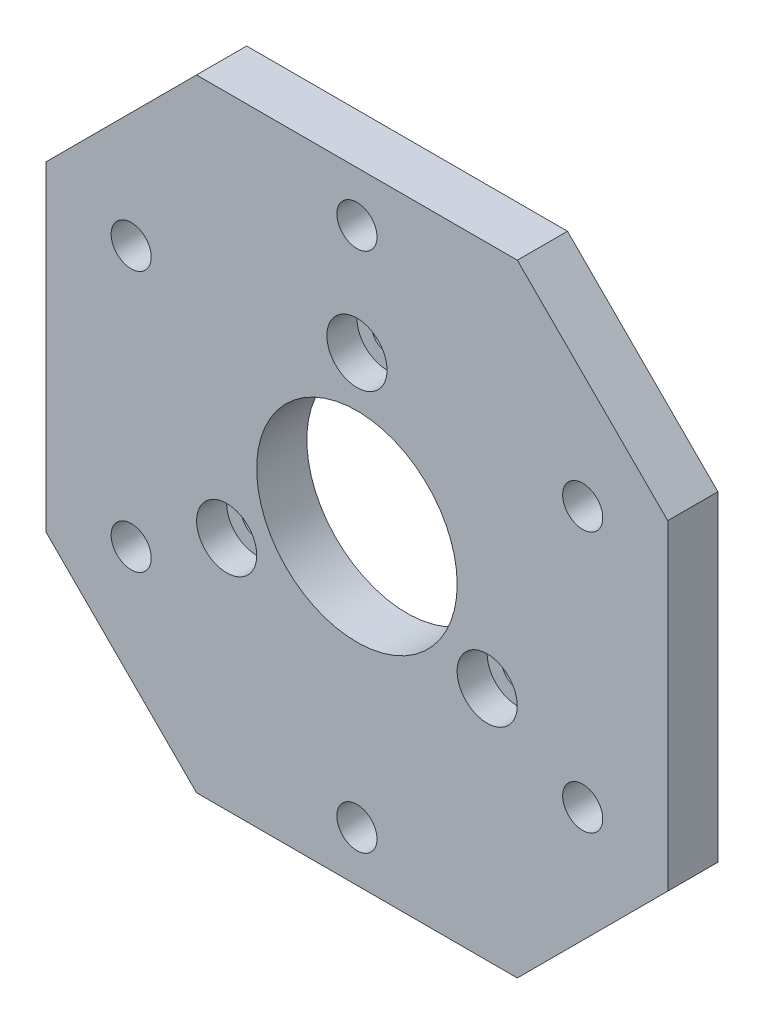
ISO-10303-21;
HEADER;
FILE_DESCRIPTION(('STEP AP214'),'2;1');
FILE_NAME('part.step','',(''),(''),'','','');
FILE_SCHEMA(('AUTOMOTIVE_DESIGN { 1 0 10303 214 1 1 1 1 }'));
ENDSEC;
DATA;
#1=APPLICATION_CONTEXT('core data for automotive mechanical design processes');
#2=APPLICATION_PROTOCOL_DEFINITION('international standard','automotive_design',2000,#1);
#3=PRODUCT_CONTEXT('',#1,'mechanical');
#4=PRODUCT('Part','Part','',(#3));
#5=PRODUCT_RELATED_PRODUCT_CATEGORY('part','',(#4));
#6=PRODUCT_DEFINITION_FORMATION('','',#4);
#7=PRODUCT_DEFINITION_CONTEXT('part definition',#1,'design');
#8=PRODUCT_DEFINITION('design','',#6,#7);
#9=PRODUCT_DEFINITION_SHAPE('','',#8);
#10=(LENGTH_UNIT() NAMED_UNIT(*) SI_UNIT(.MILLI.,.METRE.));
#11=(NAMED_UNIT(*) PLANE_ANGLE_UNIT() SI_UNIT($,.RADIAN.));
#12=(NAMED_UNIT(*) SI_UNIT($,.STERADIAN.) SOLID_ANGLE_UNIT());
#13=UNCERTAINTY_MEASURE_WITH_UNIT(LENGTH_MEASURE(1.E-05),#10,'distance_accuracy_value','');
#14=(GEOMETRIC_REPRESENTATION_CONTEXT(3) GLOBAL_UNCERTAINTY_ASSIGNED_CONTEXT((#13)) GLOBAL_UNIT_ASSIGNED_CONTEXT((#10,
#11,#12)) REPRESENTATION_CONTEXT('',''));
#15=CARTESIAN_POINT('',(0.,0.,0.));
#16=DIRECTION('',(0.,0.,1.));
#17=DIRECTION('',(1.,0.,0.));
#18=AXIS2_PLACEMENT_3D('',#15,#16,#17);
#19=CARTESIAN_POINT('',(0.,15.,5.));
#20=DIRECTION('',(0.,0.,-1.));
#21=DIRECTION('',(-1.,0.,0.));
#22=AXIS2_PLACEMENT_3D('',#19,#20,#21);
#23=CYLINDRICAL_SURFACE('',#22,1.5);
#24=CARTESIAN_POINT('',(0.,15.,0.));
#25=DIRECTION('',(0.,0.,1.));
#26=DIRECTION('',(1.,0.,0.));
#27=AXIS2_PLACEMENT_3D('',#24,#25,#26);
#28=CIRCLE('',#27,1.5);
#29=CARTESIAN_POINT('',(1.49999999999999,15.,0.));
#30=VERTEX_POINT('',#29);
#31=EDGE_CURVE('E212',#30,#30,#28,.T.);
#32=ORIENTED_EDGE('',*,*,#31,.F.);
#33=EDGE_LOOP('',(#32));
#34=FACE_BOUND('',#33,.T.);
#35=CARTESIAN_POINT('',(0.,15.,2.));
#36=DIRECTION('',(0.,0.,1.));
#37=DIRECTION('',(1.,0.,0.));
#38=AXIS2_PLACEMENT_3D('',#35,#36,#37);
#39=CIRCLE('',#38,1.5);
#40=CARTESIAN_POINT('',(1.49999999999999,15.,2.));
#41=VERTEX_POINT('',#40);
#42=EDGE_CURVE('E41',#41,#41,#39,.T.);
#43=ORIENTED_EDGE('',*,*,#42,.T.);
#44=EDGE_LOOP('',(#43));
#45=FACE_BOUND('',#44,.T.);
#46=ADVANCED_FACE('F37',(#34,#45),#23,.F.);
#47=CARTESIAN_POINT('',(12.9903810567675,-7.49999999999945,5.));
#48=DIRECTION('',(0.,0.,-1.));
#49=DIRECTION('',(-1.,0.,0.));
#50=AXIS2_PLACEMENT_3D('',#47,#48,#49);
#51=CYLINDRICAL_SURFACE('',#50,1.50000000000081);
#52=CARTESIAN_POINT('',(12.9903810567675,-7.49999999999945,0.));
#53=DIRECTION('',(0.,0.,1.));
#54=DIRECTION('',(1.,0.,0.));
#55=AXIS2_PLACEMENT_3D('',#52,#53,#54);
#56=CIRCLE('',#55,1.50000000000081);
#57=CARTESIAN_POINT('',(14.4903810567684,-7.49999999999945,0.));
#58=VERTEX_POINT('',#57);
#59=EDGE_CURVE('E181',#58,#58,#56,.T.);
#60=ORIENTED_EDGE('',*,*,#59,.F.);
#61=EDGE_LOOP('',(#60));
#62=FACE_BOUND('',#61,.T.);
#63=CARTESIAN_POINT('',(12.9903810567675,-7.49999999999945,2.));
#64=DIRECTION('',(0.,0.,1.));
#65=DIRECTION('',(1.,0.,0.));
#66=AXIS2_PLACEMENT_3D('',#63,#64,#65);
#67=CIRCLE('',#66,1.50000000000081);
#68=CARTESIAN_POINT('',(14.4903810567684,-7.49999999999945,2.));
#69=VERTEX_POINT('',#68);
#70=EDGE_CURVE('E145',#69,#69,#67,.T.);
#71=ORIENTED_EDGE('',*,*,#70,.T.);
#72=EDGE_LOOP('',(#71));
#73=FACE_BOUND('',#72,.T.);
#74=ADVANCED_FACE('F261',(#62,#73),#51,.F.);
#75=CARTESIAN_POINT('',(-12.9903810567656,-7.50000000000055,5.));
#76=DIRECTION('',(0.,0.,-1.));
#77=DIRECTION('',(-1.,0.,0.));
#78=AXIS2_PLACEMENT_3D('',#75,#76,#77);
#79=CYLINDRICAL_SURFACE('',#78,1.50000000000119);
#80=CARTESIAN_POINT('',(-12.9903810567656,-7.50000000000055,0.));
#81=DIRECTION('',(0.,0.,1.));
#82=DIRECTION('',(1.,0.,0.));
#83=AXIS2_PLACEMENT_3D('',#80,#81,#82);
#84=CIRCLE('',#83,1.50000000000119);
#85=CARTESIAN_POINT('',(-11.4903810567644,-7.50000000000055,0.));
#86=VERTEX_POINT('',#85);
#87=EDGE_CURVE('E178',#86,#86,#84,.T.);
#88=ORIENTED_EDGE('',*,*,#87,.F.);
#89=EDGE_LOOP('',(#88));
#90=FACE_BOUND('',#89,.T.);
#91=CARTESIAN_POINT('',(-12.9903810567656,-7.50000000000055,2.));
#92=DIRECTION('',(0.,0.,1.));
#93=DIRECTION('',(1.,0.,0.));
#94=AXIS2_PLACEMENT_3D('',#91,#92,#93);
#95=CIRCLE('',#94,1.50000000000119);
#96=CARTESIAN_POINT('',(-11.4903810567644,-7.50000000000055,2.));
#97=VERTEX_POINT('',#96);
#98=EDGE_CURVE('E143',#97,#97,#95,.T.);
#99=ORIENTED_EDGE('',*,*,#98,.T.);
#100=EDGE_LOOP('',(#99));
#101=FACE_BOUND('',#100,.T.);
#102=ADVANCED_FACE('F267',(#90,#101),#79,.F.);
#103=CARTESIAN_POINT('',(0.,0.,5.));
#104=DIRECTION('',(0.,0.,-1.));
#105=DIRECTION('',(-1.,0.,0.));
#106=AXIS2_PLACEMENT_3D('',#103,#104,#105);
#107=PLANE('',#106);
#108=CARTESIAN_POINT('',(0.,15.,5.));
#109=DIRECTION('',(0.,0.,1.));
#110=DIRECTION('',(1.,0.,0.));
#111=AXIS2_PLACEMENT_3D('',#108,#109,#110);
#112=CIRCLE('',#111,3.);
#113=CARTESIAN_POINT('',(2.99999999999999,15.,5.));
#114=VERTEX_POINT('',#113);
#115=EDGE_CURVE('E567',#114,#114,#112,.T.);
#116=ORIENTED_EDGE('',*,*,#115,.F.);
#117=EDGE_LOOP('',(#116));
#118=FACE_BOUND('',#117,.T.);
#119=CARTESIAN_POINT('',(12.9903810567675,-7.49999999999945,5.));
#120=DIRECTION('',(0.,0.,1.));
#121=DIRECTION('',(1.,0.,0.));
#122=AXIS2_PLACEMENT_3D('',#119,#120,#121);
#123=CIRCLE('',#122,3.);
#124=CARTESIAN_POINT('',(15.9903810567675,-7.49999999999945,5.));
#125=VERTEX_POINT('',#124);
#126=EDGE_CURVE('E564',#125,#125,#123,.T.);
#127=ORIENTED_EDGE('',*,*,#126,.F.);
#128=EDGE_LOOP('',(#127));
#129=FACE_BOUND('',#128,.T.);
#130=CARTESIAN_POINT('',(-12.9903810567656,-7.50000000000055,5.));
#131=DIRECTION('',(0.,0.,1.));
#132=DIRECTION('',(1.,0.,0.));
#133=AXIS2_PLACEMENT_3D('',#130,#131,#132);
#134=CIRCLE('',#133,3.);
#135=CARTESIAN_POINT('',(-9.99038105676562,-7.50000000000055,5.));
#136=VERTEX_POINT('',#135);
#137=EDGE_CURVE('E554',#136,#136,#134,.T.);
#138=ORIENTED_EDGE('',*,*,#137,.F.);
#139=EDGE_LOOP('',(#138));
#140=FACE_BOUND('',#139,.T.);
#141=DIRECTION('',(1.,0.,0.));
#142=VECTOR('',#141,1.);
#143=CARTESIAN_POINT('',(-31.,-31.,5.));
#144=LINE('',#143,#142);
#145=CARTESIAN_POINT('',(-16.,-31.,5.));
#146=VERTEX_POINT('',#145);
#147=CARTESIAN_POINT('',(16.,-31.,5.));
#148=VERTEX_POINT('',#147);
#149=EDGE_CURVE('E139',#146,#148,#144,.T.);
#150=ORIENTED_EDGE('',*,*,#149,.T.);
#151=DIRECTION('',(0.707106781186547,0.707106781186548,0.));
#152=VECTOR('',#151,1.);
#153=CARTESIAN_POINT('',(23.5,-23.5,5.));
#154=LINE('',#153,#152);
#155=CARTESIAN_POINT('',(31.,-16.,5.));
#156=VERTEX_POINT('',#155);
#157=EDGE_CURVE('E171',#148,#156,#154,.T.);
#158=ORIENTED_EDGE('',*,*,#157,.T.);
#159=DIRECTION('',(0.,1.,0.));
#160=VECTOR('',#159,1.);
#161=CARTESIAN_POINT('',(31.,-31.,5.));
#162=LINE('',#161,#160);
#163=CARTESIAN_POINT('',(31.,16.,5.));
#164=VERTEX_POINT('',#163);
#165=EDGE_CURVE('E134',#156,#164,#162,.T.);
#166=ORIENTED_EDGE('',*,*,#165,.T.);
#167=DIRECTION('',(-0.707106781186547,0.707106781186548,0.));
#168=VECTOR('',#167,1.);
#169=CARTESIAN_POINT('',(23.5,23.5,5.));
#170=LINE('',#169,#168);
#171=CARTESIAN_POINT('',(16.,31.,5.));
#172=VERTEX_POINT('',#171);
#173=EDGE_CURVE('E175',#164,#172,#170,.T.);
#174=ORIENTED_EDGE('',*,*,#173,.T.);
#175=DIRECTION('',(-1.,0.,0.));
#176=VECTOR('',#175,1.);
#177=CARTESIAN_POINT('',(-31.,31.,5.));
#178=LINE('',#177,#176);
#179=CARTESIAN_POINT('',(-16.,31.,5.));
#180=VERTEX_POINT('',#179);
#181=EDGE_CURVE('E230',#172,#180,#178,.T.);
#182=ORIENTED_EDGE('',*,*,#181,.T.);
#183=DIRECTION('',(-0.707106781186547,-0.707106781186548,0.));
#184=VECTOR('',#183,1.);
#185=CARTESIAN_POINT('',(-23.5,23.5,5.));
#186=LINE('',#185,#184);
#187=CARTESIAN_POINT('',(-31.,16.,5.));
#188=VERTEX_POINT('',#187);
#189=EDGE_CURVE('E104',#180,#188,#186,.T.);
#190=ORIENTED_EDGE('',*,*,#189,.T.);
#191=DIRECTION('',(0.,-1.,0.));
#192=VECTOR('',#191,1.);
#193=CARTESIAN_POINT('',(-31.,-31.,5.));
#194=LINE('',#193,#192);
#195=CARTESIAN_POINT('',(-31.,-16.,5.));
#196=VERTEX_POINT('',#195);
#197=EDGE_CURVE('E232',#188,#196,#194,.T.);
#198=ORIENTED_EDGE('',*,*,#197,.T.);
#199=DIRECTION('',(0.707106781186547,-0.707106781186548,0.));
#200=VECTOR('',#199,1.);
#201=CARTESIAN_POINT('',(-23.5,-23.5,5.));
#202=LINE('',#201,#200);
#203=EDGE_CURVE('E168',#196,#146,#202,.T.);
#204=ORIENTED_EDGE('',*,*,#203,.T.);
#205=EDGE_LOOP('',(#150,#158,#166,#174,#182,#190,#198,#204));
#206=FACE_BOUND('',#205,.T.);
#207=CARTESIAN_POINT('',(0.,0.,5.));
#208=DIRECTION('',(0.,0.,1.));
#209=DIRECTION('',(1.,0.,0.));
#210=AXIS2_PLACEMENT_3D('',#207,#208,#209);
#211=CIRCLE('',#210,10.);
#212=CARTESIAN_POINT('',(10.,0.,5.));
#213=VERTEX_POINT('',#212);
#214=EDGE_CURVE('E128',#213,#213,#211,.T.);
#215=ORIENTED_EDGE('',*,*,#214,.F.);
#216=EDGE_LOOP('',(#215));
#217=FACE_BOUND('',#216,.T.);
#218=CARTESIAN_POINT('',(0.,26.,5.));
#219=DIRECTION('',(0.,0.,1.));
#220=DIRECTION('',(1.,0.,0.));
#221=AXIS2_PLACEMENT_3D('',#218,#219,#220);
#222=CIRCLE('',#221,2.);
#223=CARTESIAN_POINT('',(1.99999999999999,26.,5.));
#224=VERTEX_POINT('',#223);
#225=EDGE_CURVE('E218',#224,#224,#222,.T.);
#226=ORIENTED_EDGE('',*,*,#225,.F.);
#227=EDGE_LOOP('',(#226));
#228=FACE_BOUND('',#227,.T.);
#229=CARTESIAN_POINT('',(22.5166604983954,13.,5.));
#230=DIRECTION('',(0.,0.,1.));
#231=DIRECTION('',(1.,0.,0.));
#232=AXIS2_PLACEMENT_3D('',#229,#230,#231);
#233=CIRCLE('',#232,2.);
#234=CARTESIAN_POINT('',(24.5166604983954,13.,5.));
#235=VERTEX_POINT('',#234);
#236=EDGE_CURVE('E209',#235,#235,#233,.T.);
#237=ORIENTED_EDGE('',*,*,#236,.F.);
#238=EDGE_LOOP('',(#237));
#239=FACE_BOUND('',#238,.T.);
#240=CARTESIAN_POINT('',(22.5166604983954,-13.0000000000001,5.));
#241=DIRECTION('',(0.,0.,1.));
#242=DIRECTION('',(1.,0.,0.));
#243=AXIS2_PLACEMENT_3D('',#240,#241,#242);
#244=CIRCLE('',#243,2.);
#245=CARTESIAN_POINT('',(24.5166604983954,-13.0000000000001,5.));
#246=VERTEX_POINT('',#245);
#247=EDGE_CURVE('E203',#246,#246,#244,.T.);
#248=ORIENTED_EDGE('',*,*,#247,.F.);
#249=EDGE_LOOP('',(#248));
#250=FACE_BOUND('',#249,.T.);
#251=CARTESIAN_POINT('',(-1.70430142773266E-13,-26.,5.));
#252=DIRECTION('',(0.,0.,1.));
#253=DIRECTION('',(1.,0.,0.));
#254=AXIS2_PLACEMENT_3D('',#251,#252,#253);
#255=CIRCLE('',#254,2.);
#256=CARTESIAN_POINT('',(1.99999999999983,-26.,5.));
#257=VERTEX_POINT('',#256);
#258=EDGE_CURVE('E197',#257,#257,#255,.T.);
#259=ORIENTED_EDGE('',*,*,#258,.F.);
#260=EDGE_LOOP('',(#259));
#261=FACE_BOUND('',#260,.T.);
#262=CARTESIAN_POINT('',(-22.5166604983955,-12.9999999999998,5.));
#263=DIRECTION('',(0.,0.,1.));
#264=DIRECTION('',(1.,0.,0.));
#265=AXIS2_PLACEMENT_3D('',#262,#263,#264);
#266=CIRCLE('',#265,2.);
#267=CARTESIAN_POINT('',(-20.5166604983955,-12.9999999999998,5.));
#268=VERTEX_POINT('',#267);
#269=EDGE_CURVE('E191',#268,#268,#266,.T.);
#270=ORIENTED_EDGE('',*,*,#269,.F.);
#271=EDGE_LOOP('',(#270));
#272=FACE_BOUND('',#271,.T.);
#273=CARTESIAN_POINT('',(-22.5166604983953,13.0000000000003,5.));
#274=DIRECTION('',(0.,0.,1.));
#275=DIRECTION('',(1.,0.,0.));
#276=AXIS2_PLACEMENT_3D('',#273,#274,#275);
#277=CIRCLE('',#276,2.00000000000001);
#278=CARTESIAN_POINT('',(-20.5166604983953,13.0000000000003,5.));
#279=VERTEX_POINT('',#278);
#280=EDGE_CURVE('E185',#279,#279,#277,.T.);
#281=ORIENTED_EDGE('',*,*,#280,.F.);
#282=EDGE_LOOP('',(#281));
#283=FACE_BOUND('',#282,.T.);
#284=ADVANCED_FACE('F237',(#118,#129,#140,#206,#217,#228,#239,#250,#261,#272,#283),#107,.F.);
#285=CARTESIAN_POINT('',(0.,0.,0.));
#286=DIRECTION('',(0.,0.,-1.));
#287=DIRECTION('',(-1.,0.,0.));
#288=AXIS2_PLACEMENT_3D('',#285,#286,#287);
#289=PLANE('',#288);
#290=DIRECTION('',(0.707106781186547,0.707106781186548,0.));
#291=VECTOR('',#290,1.);
#292=CARTESIAN_POINT('',(16.,-31.,0.));
#293=LINE('',#292,#291);
#294=CARTESIAN_POINT('',(16.,-31.,0.));
#295=VERTEX_POINT('',#294);
#296=CARTESIAN_POINT('',(31.,-16.,0.));
#297=VERTEX_POINT('',#296);
#298=EDGE_CURVE('E155',#295,#297,#293,.T.);
#299=ORIENTED_EDGE('',*,*,#298,.F.);
#300=DIRECTION('',(1.,0.,0.));
#301=VECTOR('',#300,1.);
#302=CARTESIAN_POINT('',(-31.,-31.,0.));
#303=LINE('',#302,#301);
#304=CARTESIAN_POINT('',(-16.,-31.,0.));
#305=VERTEX_POINT('',#304);
#306=EDGE_CURVE('E125',#305,#295,#303,.T.);
#307=ORIENTED_EDGE('',*,*,#306,.F.);
#308=DIRECTION('',(0.707106781186547,-0.707106781186548,0.));
#309=VECTOR('',#308,1.);
#310=CARTESIAN_POINT('',(-16.,-31.,0.));
#311=LINE('',#310,#309);
#312=CARTESIAN_POINT('',(-31.,-16.,0.));
#313=VERTEX_POINT('',#312);
#314=EDGE_CURVE('E109',#313,#305,#311,.T.);
#315=ORIENTED_EDGE('',*,*,#314,.F.);
#316=DIRECTION('',(0.,-1.,0.));
#317=VECTOR('',#316,1.);
#318=CARTESIAN_POINT('',(-31.,-31.,0.));
#319=LINE('',#318,#317);
#320=CARTESIAN_POINT('',(-31.,16.,0.));
#321=VERTEX_POINT('',#320);
#322=EDGE_CURVE('E120',#321,#313,#319,.T.);
#323=ORIENTED_EDGE('',*,*,#322,.F.);
#324=DIRECTION('',(-0.707106781186547,-0.707106781186548,0.));
#325=VECTOR('',#324,1.);
#326=CARTESIAN_POINT('',(-16.,31.,0.));
#327=LINE('',#326,#325);
#328=CARTESIAN_POINT('',(-16.,31.,0.));
#329=VERTEX_POINT('',#328);
#330=EDGE_CURVE('E61',#329,#321,#327,.T.);
#331=ORIENTED_EDGE('',*,*,#330,.F.);
#332=DIRECTION('',(-1.,0.,0.));
#333=VECTOR('',#332,1.);
#334=CARTESIAN_POINT('',(-31.,31.,0.));
#335=LINE('',#334,#333);
#336=CARTESIAN_POINT('',(16.,31.,0.));
#337=VERTEX_POINT('',#336);
#338=EDGE_CURVE('E117',#337,#329,#335,.T.);
#339=ORIENTED_EDGE('',*,*,#338,.F.);
#340=DIRECTION('',(-0.707106781186547,0.707106781186548,0.));
#341=VECTOR('',#340,1.);
#342=CARTESIAN_POINT('',(16.,31.,0.));
#343=LINE('',#342,#341);
#344=CARTESIAN_POINT('',(31.,16.,0.));
#345=VERTEX_POINT('',#344);
#346=EDGE_CURVE('E54',#345,#337,#343,.T.);
#347=ORIENTED_EDGE('',*,*,#346,.F.);
#348=DIRECTION('',(0.,1.,0.));
#349=VECTOR('',#348,1.);
#350=CARTESIAN_POINT('',(31.,-31.,0.));
#351=LINE('',#350,#349);
#352=EDGE_CURVE('E123',#297,#345,#351,.T.);
#353=ORIENTED_EDGE('',*,*,#352,.F.);
#354=EDGE_LOOP('',(#299,#307,#315,#323,#331,#339,#347,#353));
#355=FACE_BOUND('',#354,.T.);
#356=ORIENTED_EDGE('',*,*,#59,.T.);
#357=EDGE_LOOP('',(#356));
#358=FACE_BOUND('',#357,.T.);
#359=CARTESIAN_POINT('',(-22.5166604983955,-12.9999999999998,0.));
#360=DIRECTION('',(0.,0.,1.));
#361=DIRECTION('',(1.,0.,0.));
#362=AXIS2_PLACEMENT_3D('',#359,#360,#361);
#363=CIRCLE('',#362,2.);
#364=CARTESIAN_POINT('',(-20.5166604983955,-12.9999999999998,0.));
#365=VERTEX_POINT('',#364);
#366=EDGE_CURVE('E188',#365,#365,#363,.T.);
#367=ORIENTED_EDGE('',*,*,#366,.T.);
#368=EDGE_LOOP('',(#367));
#369=FACE_BOUND('',#368,.T.);
#370=CARTESIAN_POINT('',(22.5166604983954,-13.0000000000001,0.));
#371=DIRECTION('',(0.,0.,1.));
#372=DIRECTION('',(1.,0.,0.));
#373=AXIS2_PLACEMENT_3D('',#370,#371,#372);
#374=CIRCLE('',#373,2.);
#375=CARTESIAN_POINT('',(24.5166604983954,-13.0000000000001,0.));
#376=VERTEX_POINT('',#375);
#377=EDGE_CURVE('E200',#376,#376,#374,.T.);
#378=ORIENTED_EDGE('',*,*,#377,.T.);
#379=EDGE_LOOP('',(#378));
#380=FACE_BOUND('',#379,.T.);
#381=ORIENTED_EDGE('',*,*,#31,.T.);
#382=EDGE_LOOP('',(#381));
#383=FACE_BOUND('',#382,.T.);
#384=CARTESIAN_POINT('',(0.,0.,0.));
#385=DIRECTION('',(0.,0.,1.));
#386=DIRECTION('',(1.,0.,0.));
#387=AXIS2_PLACEMENT_3D('',#384,#385,#386);
#388=CIRCLE('',#387,10.);
#389=CARTESIAN_POINT('',(10.,0.,0.));
#390=VERTEX_POINT('',#389);
#391=EDGE_CURVE('E221',#390,#390,#388,.T.);
#392=ORIENTED_EDGE('',*,*,#391,.T.);
#393=EDGE_LOOP('',(#392));
#394=FACE_BOUND('',#393,.T.);
#395=CARTESIAN_POINT('',(0.,26.,0.));
#396=DIRECTION('',(0.,0.,1.));
#397=DIRECTION('',(1.,0.,0.));
#398=AXIS2_PLACEMENT_3D('',#395,#396,#397);
#399=CIRCLE('',#398,2.);
#400=CARTESIAN_POINT('',(1.99999999999999,26.,0.));
#401=VERTEX_POINT('',#400);
#402=EDGE_CURVE('E217',#401,#401,#399,.T.);
#403=ORIENTED_EDGE('',*,*,#402,.T.);
#404=EDGE_LOOP('',(#403));
#405=FACE_BOUND('',#404,.T.);
#406=CARTESIAN_POINT('',(22.5166604983954,13.,0.));
#407=DIRECTION('',(0.,0.,1.));
#408=DIRECTION('',(1.,0.,0.));
#409=AXIS2_PLACEMENT_3D('',#406,#407,#408);
#410=CIRCLE('',#409,2.);
#411=CARTESIAN_POINT('',(24.5166604983954,13.,0.));
#412=VERTEX_POINT('',#411);
#413=EDGE_CURVE('E206',#412,#412,#410,.T.);
#414=ORIENTED_EDGE('',*,*,#413,.T.);
#415=EDGE_LOOP('',(#414));
#416=FACE_BOUND('',#415,.T.);
#417=CARTESIAN_POINT('',(-1.70430142773266E-13,-26.,0.));
#418=DIRECTION('',(0.,0.,1.));
#419=DIRECTION('',(1.,0.,0.));
#420=AXIS2_PLACEMENT_3D('',#417,#418,#419);
#421=CIRCLE('',#420,2.);
#422=CARTESIAN_POINT('',(1.99999999999983,-26.,0.));
#423=VERTEX_POINT('',#422);
#424=EDGE_CURVE('E194',#423,#423,#421,.T.);
#425=ORIENTED_EDGE('',*,*,#424,.T.);
#426=EDGE_LOOP('',(#425));
#427=FACE_BOUND('',#426,.T.);
#428=CARTESIAN_POINT('',(-22.5166604983953,13.0000000000003,0.));
#429=DIRECTION('',(0.,0.,1.));
#430=DIRECTION('',(1.,0.,0.));
#431=AXIS2_PLACEMENT_3D('',#428,#429,#430);
#432=CIRCLE('',#431,2.00000000000001);
#433=CARTESIAN_POINT('',(-20.5166604983953,13.0000000000003,0.));
#434=VERTEX_POINT('',#433);
#435=EDGE_CURVE('E184',#434,#434,#432,.T.);
#436=ORIENTED_EDGE('',*,*,#435,.T.);
#437=EDGE_LOOP('',(#436));
#438=FACE_BOUND('',#437,.T.);
#439=ORIENTED_EDGE('',*,*,#87,.T.);
#440=EDGE_LOOP('',(#439));
#441=FACE_BOUND('',#440,.T.);
#442=ADVANCED_FACE('F115',(#355,#358,#369,#380,#383,#394,#405,#416,#427,#438,#441),#289,.T.);
#443=CARTESIAN_POINT('',(31.,-31.,5.));
#444=DIRECTION('',(-1.,0.,0.));
#445=DIRECTION('',(0.,0.,1.));
#446=AXIS2_PLACEMENT_3D('',#443,#444,#445);
#447=PLANE('',#446);
#448=ORIENTED_EDGE('',*,*,#165,.F.);
#449=DIRECTION('',(0.,0.,-1.));
#450=VECTOR('',#449,1.);
#451=CARTESIAN_POINT('',(31.,-16.,10.));
#452=LINE('',#451,#450);
#453=EDGE_CURVE('E151',#156,#297,#452,.T.);
#454=ORIENTED_EDGE('',*,*,#453,.T.);
#455=ORIENTED_EDGE('',*,*,#352,.T.);
#456=DIRECTION('',(0.,0.,-1.));
#457=VECTOR('',#456,1.);
#458=CARTESIAN_POINT('',(31.,16.,10.));
#459=LINE('',#458,#457);
#460=EDGE_CURVE('E166',#164,#345,#459,.T.);
#461=ORIENTED_EDGE('',*,*,#460,.F.);
#462=EDGE_LOOP('',(#448,#454,#455,#461));
#463=FACE_BOUND('',#462,.T.);
#464=ADVANCED_FACE('F39',(#463),#447,.F.);
#465=CARTESIAN_POINT('',(-31.,31.,5.));
#466=DIRECTION('',(0.,-1.,0.));
#467=DIRECTION('',(0.,0.,-1.));
#468=AXIS2_PLACEMENT_3D('',#465,#466,#467);
#469=PLANE('',#468);
#470=ORIENTED_EDGE('',*,*,#338,.T.);
#471=DIRECTION('',(0.,0.,-1.));
#472=VECTOR('',#471,1.);
#473=CARTESIAN_POINT('',(-16.,31.,10.));
#474=LINE('',#473,#472);
#475=EDGE_CURVE('E101',#180,#329,#474,.T.);
#476=ORIENTED_EDGE('',*,*,#475,.F.);
#477=ORIENTED_EDGE('',*,*,#181,.F.);
#478=DIRECTION('',(0.,0.,-1.));
#479=VECTOR('',#478,1.);
#480=CARTESIAN_POINT('',(16.,31.,5.));
#481=LINE('',#480,#479);
#482=EDGE_CURVE('E11',#172,#337,#481,.T.);
#483=ORIENTED_EDGE('',*,*,#482,.T.);
#484=EDGE_LOOP('',(#470,#476,#477,#483));
#485=FACE_BOUND('',#484,.T.);
#486=ADVANCED_FACE('F122',(#485),#469,.F.);
#487=CARTESIAN_POINT('',(-31.,-31.,5.));
#488=DIRECTION('',(1.,0.,0.));
#489=DIRECTION('',(0.,0.,-1.));
#490=AXIS2_PLACEMENT_3D('',#487,#488,#489);
#491=PLANE('',#490);
#492=ORIENTED_EDGE('',*,*,#322,.T.);
#493=DIRECTION('',(0.,0.,-1.));
#494=VECTOR('',#493,1.);
#495=CARTESIAN_POINT('',(-31.,-16.,10.));
#496=LINE('',#495,#494);
#497=EDGE_CURVE('E160',#196,#313,#496,.T.);
#498=ORIENTED_EDGE('',*,*,#497,.F.);
#499=ORIENTED_EDGE('',*,*,#197,.F.);
#500=DIRECTION('',(0.,0.,-1.));
#501=VECTOR('',#500,1.);
#502=CARTESIAN_POINT('',(-31.,16.,5.));
#503=LINE('',#502,#501);
#504=EDGE_CURVE('E46',#188,#321,#503,.T.);
#505=ORIENTED_EDGE('',*,*,#504,.T.);
#506=EDGE_LOOP('',(#492,#498,#499,#505));
#507=FACE_BOUND('',#506,.T.);
#508=ADVANCED_FACE('F290',(#507),#491,.F.);
#509=CARTESIAN_POINT('',(-31.,-31.,5.));
#510=DIRECTION('',(0.,1.,0.));
#511=DIRECTION('',(0.,0.,1.));
#512=AXIS2_PLACEMENT_3D('',#509,#510,#511);
#513=PLANE('',#512);
#514=ORIENTED_EDGE('',*,*,#306,.T.);
#515=DIRECTION('',(0.,0.,1.));
#516=VECTOR('',#515,1.);
#517=CARTESIAN_POINT('',(16.,-31.,5.));
#518=LINE('',#517,#516);
#519=EDGE_CURVE('E138',#295,#148,#518,.T.);
#520=ORIENTED_EDGE('',*,*,#519,.T.);
#521=ORIENTED_EDGE('',*,*,#149,.F.);
#522=DIRECTION('',(0.,0.,-1.));
#523=VECTOR('',#522,1.);
#524=CARTESIAN_POINT('',(-16.,-31.,5.));
#525=LINE('',#524,#523);
#526=EDGE_CURVE('E135',#146,#305,#525,.T.);
#527=ORIENTED_EDGE('',*,*,#526,.T.);
#528=EDGE_LOOP('',(#514,#520,#521,#527));
#529=FACE_BOUND('',#528,.T.);
#530=ADVANCED_FACE('F240',(#529),#513,.F.);
#531=CARTESIAN_POINT('',(0.,0.,5.));
#532=DIRECTION('',(0.,0.,-1.));
#533=DIRECTION('',(-1.,0.,0.));
#534=AXIS2_PLACEMENT_3D('',#531,#532,#533);
#535=CYLINDRICAL_SURFACE('',#534,10.);
#536=ORIENTED_EDGE('',*,*,#214,.T.);
#537=EDGE_LOOP('',(#536));
#538=FACE_BOUND('',#537,.T.);
#539=ORIENTED_EDGE('',*,*,#391,.F.);
#540=EDGE_LOOP('',(#539));
#541=FACE_BOUND('',#540,.T.);
#542=ADVANCED_FACE('F278',(#538,#541),#535,.F.);
#543=CARTESIAN_POINT('',(0.,26.,5.));
#544=DIRECTION('',(0.,0.,-1.));
#545=DIRECTION('',(-1.,0.,0.));
#546=AXIS2_PLACEMENT_3D('',#543,#544,#545);
#547=CYLINDRICAL_SURFACE('',#546,2.);
#548=ORIENTED_EDGE('',*,*,#225,.T.);
#549=EDGE_LOOP('',(#548));
#550=FACE_BOUND('',#549,.T.);
#551=ORIENTED_EDGE('',*,*,#402,.F.);
#552=EDGE_LOOP('',(#551));
#553=FACE_BOUND('',#552,.T.);
#554=ADVANCED_FACE('F275',(#550,#553),#547,.F.);
#555=CARTESIAN_POINT('',(22.5166604983954,13.,5.));
#556=DIRECTION('',(0.,0.,-1.));
#557=DIRECTION('',(-1.,0.,0.));
#558=AXIS2_PLACEMENT_3D('',#555,#556,#557);
#559=CYLINDRICAL_SURFACE('',#558,2.);
#560=ORIENTED_EDGE('',*,*,#236,.T.);
#561=EDGE_LOOP('',(#560));
#562=FACE_BOUND('',#561,.T.);
#563=ORIENTED_EDGE('',*,*,#413,.F.);
#564=EDGE_LOOP('',(#563));
#565=FACE_BOUND('',#564,.T.);
#566=ADVANCED_FACE('F273',(#562,#565),#559,.F.);
#567=CARTESIAN_POINT('',(22.5166604983954,-13.0000000000001,5.));
#568=DIRECTION('',(0.,0.,-1.));
#569=DIRECTION('',(-1.,0.,0.));
#570=AXIS2_PLACEMENT_3D('',#567,#568,#569);
#571=CYLINDRICAL_SURFACE('',#570,2.);
#572=ORIENTED_EDGE('',*,*,#247,.T.);
#573=EDGE_LOOP('',(#572));
#574=FACE_BOUND('',#573,.T.);
#575=ORIENTED_EDGE('',*,*,#377,.F.);
#576=EDGE_LOOP('',(#575));
#577=FACE_BOUND('',#576,.T.);
#578=ADVANCED_FACE('F453',(#574,#577),#571,.F.);
#579=CARTESIAN_POINT('',(-1.70430142773266E-13,-26.,5.));
#580=DIRECTION('',(0.,0.,-1.));
#581=DIRECTION('',(-1.,0.,0.));
#582=AXIS2_PLACEMENT_3D('',#579,#580,#581);
#583=CYLINDRICAL_SURFACE('',#582,2.);
#584=ORIENTED_EDGE('',*,*,#258,.T.);
#585=EDGE_LOOP('',(#584));
#586=FACE_BOUND('',#585,.T.);
#587=ORIENTED_EDGE('',*,*,#424,.F.);
#588=EDGE_LOOP('',(#587));
#589=FACE_BOUND('',#588,.T.);
#590=ADVANCED_FACE('F443',(#586,#589),#583,.F.);
#591=CARTESIAN_POINT('',(-22.5166604983955,-12.9999999999998,5.));
#592=DIRECTION('',(0.,0.,-1.));
#593=DIRECTION('',(-1.,0.,0.));
#594=AXIS2_PLACEMENT_3D('',#591,#592,#593);
#595=CYLINDRICAL_SURFACE('',#594,2.);
#596=ORIENTED_EDGE('',*,*,#269,.T.);
#597=EDGE_LOOP('',(#596));
#598=FACE_BOUND('',#597,.T.);
#599=ORIENTED_EDGE('',*,*,#366,.F.);
#600=EDGE_LOOP('',(#599));
#601=FACE_BOUND('',#600,.T.);
#602=ADVANCED_FACE('F434',(#598,#601),#595,.F.);
#603=CARTESIAN_POINT('',(-22.5166604983953,13.0000000000003,5.));
#604=DIRECTION('',(0.,0.,-1.));
#605=DIRECTION('',(-1.,0.,0.));
#606=AXIS2_PLACEMENT_3D('',#603,#604,#605);
#607=CYLINDRICAL_SURFACE('',#606,2.00000000000001);
#608=ORIENTED_EDGE('',*,*,#280,.T.);
#609=EDGE_LOOP('',(#608));
#610=FACE_BOUND('',#609,.T.);
#611=ORIENTED_EDGE('',*,*,#435,.F.);
#612=EDGE_LOOP('',(#611));
#613=FACE_BOUND('',#612,.T.);
#614=ADVANCED_FACE('F424',(#610,#613),#607,.F.);
#615=CARTESIAN_POINT('',(-16.,-31.,10.));
#616=DIRECTION('',(0.707106781186548,0.707106781186547,0.));
#617=DIRECTION('',(-0.707106781186547,0.707106781186548,0.));
#618=AXIS2_PLACEMENT_3D('',#615,#616,#617);
#619=PLANE('',#618);
#620=ORIENTED_EDGE('',*,*,#497,.T.);
#621=ORIENTED_EDGE('',*,*,#314,.T.);
#622=ORIENTED_EDGE('',*,*,#526,.F.);
#623=ORIENTED_EDGE('',*,*,#203,.F.);
#624=EDGE_LOOP('',(#620,#621,#622,#623));
#625=FACE_BOUND('',#624,.T.);
#626=ADVANCED_FACE('F416',(#625),#619,.F.);
#627=CARTESIAN_POINT('',(16.,-31.,10.));
#628=DIRECTION('',(-0.707106781186548,0.707106781186547,0.));
#629=DIRECTION('',(-0.707106781186547,-0.707106781186548,0.));
#630=AXIS2_PLACEMENT_3D('',#627,#628,#629);
#631=PLANE('',#630);
#632=ORIENTED_EDGE('',*,*,#519,.F.);
#633=ORIENTED_EDGE('',*,*,#298,.T.);
#634=ORIENTED_EDGE('',*,*,#453,.F.);
#635=ORIENTED_EDGE('',*,*,#157,.F.);
#636=EDGE_LOOP('',(#632,#633,#634,#635));
#637=FACE_BOUND('',#636,.T.);
#638=ADVANCED_FACE('F243',(#637),#631,.F.);
#639=CARTESIAN_POINT('',(-16.,31.,10.));
#640=DIRECTION('',(0.707106781186548,-0.707106781186547,0.));
#641=DIRECTION('',(0.707106781186547,0.707106781186548,0.));
#642=AXIS2_PLACEMENT_3D('',#639,#640,#641);
#643=PLANE('',#642);
#644=ORIENTED_EDGE('',*,*,#475,.T.);
#645=ORIENTED_EDGE('',*,*,#330,.T.);
#646=ORIENTED_EDGE('',*,*,#504,.F.);
#647=ORIENTED_EDGE('',*,*,#189,.F.);
#648=EDGE_LOOP('',(#644,#645,#646,#647));
#649=FACE_BOUND('',#648,.T.);
#650=ADVANCED_FACE('F102',(#649),#643,.F.);
#651=CARTESIAN_POINT('',(16.,31.,10.));
#652=DIRECTION('',(-0.707106781186548,-0.707106781186547,0.));
#653=DIRECTION('',(0.707106781186547,-0.707106781186548,0.));
#654=AXIS2_PLACEMENT_3D('',#651,#652,#653);
#655=PLANE('',#654);
#656=ORIENTED_EDGE('',*,*,#460,.T.);
#657=ORIENTED_EDGE('',*,*,#346,.T.);
#658=ORIENTED_EDGE('',*,*,#482,.F.);
#659=ORIENTED_EDGE('',*,*,#173,.F.);
#660=EDGE_LOOP('',(#656,#657,#658,#659));
#661=FACE_BOUND('',#660,.T.);
#662=ADVANCED_FACE('F245',(#661),#655,.F.);
#663=CARTESIAN_POINT('',(-12.9903810567656,-7.50000000000055,2.));
#664=DIRECTION('',(0.,0.,1.));
#665=DIRECTION('',(1.,0.,0.));
#666=AXIS2_PLACEMENT_3D('',#663,#664,#665);
#667=CYLINDRICAL_SURFACE('',#666,3.);
#668=CARTESIAN_POINT('',(-12.9903810567656,-7.50000000000055,2.));
#669=DIRECTION('',(0.,0.,1.));
#670=DIRECTION('',(1.,0.,0.));
#671=AXIS2_PLACEMENT_3D('',#668,#669,#670);
#672=CIRCLE('',#671,3.);
#673=CARTESIAN_POINT('',(-9.99038105676562,-7.50000000000055,2.));
#674=VERTEX_POINT('',#673);
#675=EDGE_CURVE('E553',#674,#674,#672,.T.);
#676=ORIENTED_EDGE('',*,*,#675,.F.);
#677=EDGE_LOOP('',(#676));
#678=FACE_BOUND('',#677,.T.);
#679=ORIENTED_EDGE('',*,*,#137,.T.);
#680=EDGE_LOOP('',(#679));
#681=FACE_BOUND('',#680,.T.);
#682=ADVANCED_FACE('F247',(#678,#681),#667,.F.);
#683=CARTESIAN_POINT('',(-12.9903810567656,-7.50000000000055,2.));
#684=DIRECTION('',(0.,0.,1.));
#685=DIRECTION('',(1.,0.,0.));
#686=AXIS2_PLACEMENT_3D('',#683,#684,#685);
#687=PLANE('',#686);
#688=ORIENTED_EDGE('',*,*,#98,.F.);
#689=EDGE_LOOP('',(#688));
#690=FACE_BOUND('',#689,.T.);
#691=ORIENTED_EDGE('',*,*,#675,.T.);
#692=EDGE_LOOP('',(#691));
#693=FACE_BOUND('',#692,.T.);
#694=ADVANCED_FACE('F254',(#690,#693),#687,.T.);
#695=CARTESIAN_POINT('',(12.9903810567675,-7.49999999999945,2.));
#696=DIRECTION('',(0.,0.,1.));
#697=DIRECTION('',(1.,0.,0.));
#698=AXIS2_PLACEMENT_3D('',#695,#696,#697);
#699=CYLINDRICAL_SURFACE('',#698,3.);
#700=CARTESIAN_POINT('',(12.9903810567675,-7.49999999999945,2.));
#701=DIRECTION('',(0.,0.,1.));
#702=DIRECTION('',(1.,0.,0.));
#703=AXIS2_PLACEMENT_3D('',#700,#701,#702);
#704=CIRCLE('',#703,3.);
#705=CARTESIAN_POINT('',(15.9903810567675,-7.49999999999945,2.));
#706=VERTEX_POINT('',#705);
#707=EDGE_CURVE('E557',#706,#706,#704,.T.);
#708=ORIENTED_EDGE('',*,*,#707,.F.);
#709=EDGE_LOOP('',(#708));
#710=FACE_BOUND('',#709,.T.);
#711=ORIENTED_EDGE('',*,*,#126,.T.);
#712=EDGE_LOOP('',(#711));
#713=FACE_BOUND('',#712,.T.);
#714=ADVANCED_FACE('F330',(#710,#713),#699,.F.);
#715=CARTESIAN_POINT('',(12.9903810567675,-7.49999999999945,2.));
#716=DIRECTION('',(0.,0.,1.));
#717=DIRECTION('',(1.,0.,0.));
#718=AXIS2_PLACEMENT_3D('',#715,#716,#717);
#719=PLANE('',#718);
#720=ORIENTED_EDGE('',*,*,#70,.F.);
#721=EDGE_LOOP('',(#720));
#722=FACE_BOUND('',#721,.T.);
#723=ORIENTED_EDGE('',*,*,#707,.T.);
#724=EDGE_LOOP('',(#723));
#725=FACE_BOUND('',#724,.T.);
#726=ADVANCED_FACE('F341',(#722,#725),#719,.T.);
#727=CARTESIAN_POINT('',(0.,15.,2.));
#728=DIRECTION('',(0.,0.,1.));
#729=DIRECTION('',(1.,0.,0.));
#730=AXIS2_PLACEMENT_3D('',#727,#728,#729);
#731=CYLINDRICAL_SURFACE('',#730,3.);
#732=CARTESIAN_POINT('',(0.,15.,2.));
#733=DIRECTION('',(0.,0.,1.));
#734=DIRECTION('',(1.,0.,0.));
#735=AXIS2_PLACEMENT_3D('',#732,#733,#734);
#736=CIRCLE('',#735,3.);
#737=CARTESIAN_POINT('',(2.99999999999999,15.,2.));
#738=VERTEX_POINT('',#737);
#739=EDGE_CURVE('E146',#738,#738,#736,.T.);
#740=ORIENTED_EDGE('',*,*,#739,.F.);
#741=EDGE_LOOP('',(#740));
#742=FACE_BOUND('',#741,.T.);
#743=ORIENTED_EDGE('',*,*,#115,.T.);
#744=EDGE_LOOP('',(#743));
#745=FACE_BOUND('',#744,.T.);
#746=ADVANCED_FACE('F352',(#742,#745),#731,.F.);
#747=CARTESIAN_POINT('',(0.,15.,2.));
#748=DIRECTION('',(0.,0.,1.));
#749=DIRECTION('',(1.,0.,0.));
#750=AXIS2_PLACEMENT_3D('',#747,#748,#749);
#751=PLANE('',#750);
#752=ORIENTED_EDGE('',*,*,#42,.F.);
#753=EDGE_LOOP('',(#752));
#754=FACE_BOUND('',#753,.T.);
#755=ORIENTED_EDGE('',*,*,#739,.T.);
#756=EDGE_LOOP('',(#755));
#757=FACE_BOUND('',#756,.T.);
#758=ADVANCED_FACE('F363',(#754,#757),#751,.T.);
#759=CLOSED_SHELL('',(#46,#74,#102,#284,#442,#464,#486,#508,#530,#542,#554,#566,#578,#590,#602,
#614,#626,#638,#650,#662,#682,#694,#714,#726,#746,#758));
#760=MANIFOLD_SOLID_BREP('B2',#759);
#761=ADVANCED_BREP_SHAPE_REPRESENTATION('',(#18,#760),#14);
#762=SHAPE_DEFINITION_REPRESENTATION(#9,#761);
ENDSEC;
END-ISO-10303-21;
